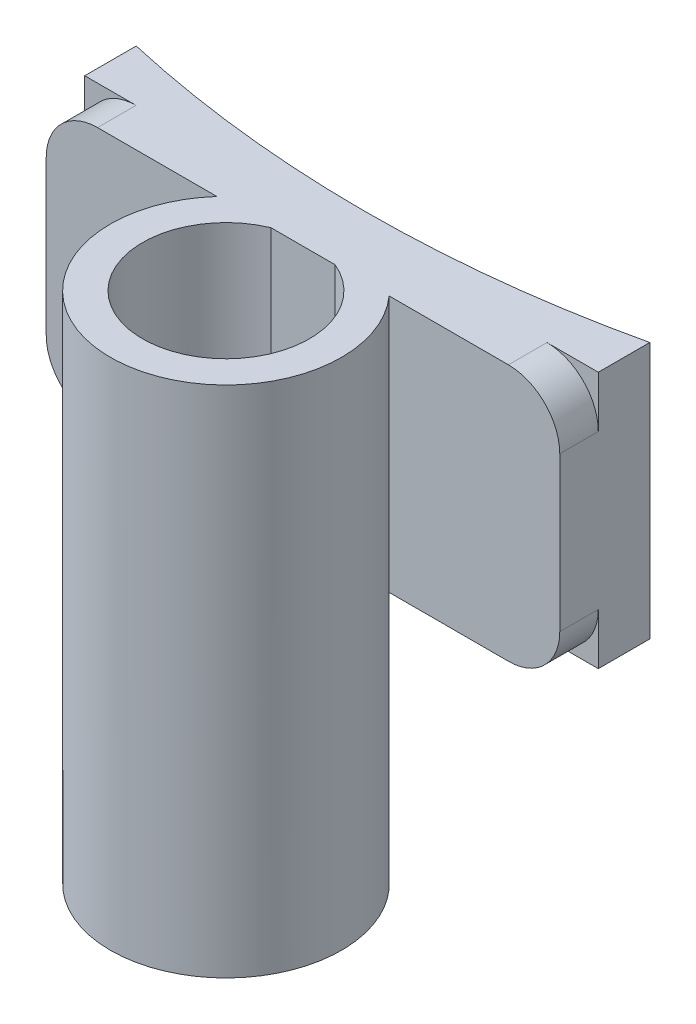
ISO-10303-21;
HEADER;
FILE_DESCRIPTION(('STEP AP214'),'2;1');
FILE_NAME('part.step','',(''),(''),'','','');
FILE_SCHEMA(('AUTOMOTIVE_DESIGN { 1 0 10303 214 1 1 1 1 }'));
ENDSEC;
DATA;
#1=APPLICATION_CONTEXT('core data for automotive mechanical design processes');
#2=APPLICATION_PROTOCOL_DEFINITION('international standard','automotive_design',2000,#1);
#3=PRODUCT_CONTEXT('',#1,'mechanical');
#4=PRODUCT('Part','Part','',(#3));
#5=PRODUCT_RELATED_PRODUCT_CATEGORY('part','',(#4));
#6=PRODUCT_DEFINITION_FORMATION('','',#4);
#7=PRODUCT_DEFINITION_CONTEXT('part definition',#1,'design');
#8=PRODUCT_DEFINITION('design','',#6,#7);
#9=PRODUCT_DEFINITION_SHAPE('','',#8);
#10=(LENGTH_UNIT() NAMED_UNIT(*) SI_UNIT(.MILLI.,.METRE.));
#11=(NAMED_UNIT(*) PLANE_ANGLE_UNIT() SI_UNIT($,.RADIAN.));
#12=(NAMED_UNIT(*) SI_UNIT($,.STERADIAN.) SOLID_ANGLE_UNIT());
#13=UNCERTAINTY_MEASURE_WITH_UNIT(LENGTH_MEASURE(1.E-05),#10,'distance_accuracy_value','');
#14=(GEOMETRIC_REPRESENTATION_CONTEXT(3) GLOBAL_UNCERTAINTY_ASSIGNED_CONTEXT((#13)) GLOBAL_UNIT_ASSIGNED_CONTEXT((#10,
#11,#12)) REPRESENTATION_CONTEXT('',''));
#15=CARTESIAN_POINT('',(0.,0.,0.));
#16=DIRECTION('',(0.,0.,1.));
#17=DIRECTION('',(1.,0.,0.));
#18=AXIS2_PLACEMENT_3D('',#15,#16,#17);
#19=CARTESIAN_POINT('',(0.,20.,0.));
#20=DIRECTION('',(0.,-1.,0.));
#21=DIRECTION('',(0.,0.,-1.));
#22=AXIS2_PLACEMENT_3D('',#19,#20,#21);
#23=CYLINDRICAL_SURFACE('',#22,4.5);
#24=CARTESIAN_POINT('',(0.,0.,0.));
#25=DIRECTION('',(0.,1.,0.));
#26=DIRECTION('',(0.,0.,1.));
#27=AXIS2_PLACEMENT_3D('',#24,#25,#26);
#28=CIRCLE('',#27,4.5);
#29=CARTESIAN_POINT('',(0.,0.,4.5));
#30=VERTEX_POINT('',#29);
#31=EDGE_CURVE('E252',#30,#30,#28,.T.);
#32=ORIENTED_EDGE('',*,*,#31,.T.);
#33=EDGE_LOOP('',(#32));
#34=FACE_BOUND('',#33,.T.);
#35=DIRECTION('',(0.,-1.,0.));
#36=VECTOR('',#35,1.);
#37=CARTESIAN_POINT('',(3.35410196624968,20.,-3.));
#38=LINE('',#37,#36);
#39=CARTESIAN_POINT('',(3.35410196624968,20.,-3.));
#40=VERTEX_POINT('',#39);
#41=CARTESIAN_POINT('',(3.35410196624968,10.,-3.));
#42=VERTEX_POINT('',#41);
#43=EDGE_CURVE('E240',#40,#42,#38,.T.);
#44=ORIENTED_EDGE('',*,*,#43,.F.);
#45=CARTESIAN_POINT('',(0.,20.,0.));
#46=DIRECTION('',(0.,1.,0.));
#47=DIRECTION('',(0.,0.,1.));
#48=AXIS2_PLACEMENT_3D('',#45,#46,#47);
#49=CIRCLE('',#48,4.5);
#50=CARTESIAN_POINT('',(-3.35410196624968,20.,-3.));
#51=VERTEX_POINT('',#50);
#52=EDGE_CURVE('E256',#51,#40,#49,.T.);
#53=ORIENTED_EDGE('',*,*,#52,.F.);
#54=DIRECTION('',(0.,-1.,0.));
#55=VECTOR('',#54,1.);
#56=CARTESIAN_POINT('',(-3.35410196624968,20.,-3.));
#57=LINE('',#56,#55);
#58=CARTESIAN_POINT('',(-3.35410196624968,10.,-3.));
#59=VERTEX_POINT('',#58);
#60=EDGE_CURVE('E236',#59,#51,#57,.F.);
#61=ORIENTED_EDGE('',*,*,#60,.F.);
#62=CARTESIAN_POINT('',(0.,10.,0.));
#63=DIRECTION('',(0.,1.,0.));
#64=DIRECTION('',(0.,0.,1.));
#65=AXIS2_PLACEMENT_3D('',#62,#63,#64);
#66=CIRCLE('',#65,4.5);
#67=EDGE_CURVE('E244',#42,#59,#66,.T.);
#68=ORIENTED_EDGE('',*,*,#67,.F.);
#69=EDGE_LOOP('',(#44,#53,#61,#68));
#70=FACE_BOUND('',#69,.T.);
#71=ADVANCED_FACE('F39',(#34,#70),#23,.T.);
#72=CARTESIAN_POINT('',(0.,20.,0.));
#73=DIRECTION('',(0.,-1.,0.));
#74=DIRECTION('',(0.,0.,-1.));
#75=AXIS2_PLACEMENT_3D('',#72,#73,#74);
#76=CYLINDRICAL_SURFACE('',#75,3.25);
#77=CARTESIAN_POINT('',(0.,0.,0.));
#78=DIRECTION('',(0.,1.,0.));
#79=DIRECTION('',(0.,0.,1.));
#80=AXIS2_PLACEMENT_3D('',#77,#78,#79);
#81=CIRCLE('',#80,3.25);
#82=CARTESIAN_POINT('',(0.,0.,3.25));
#83=VERTEX_POINT('',#82);
#84=EDGE_CURVE('E247',#83,#83,#81,.T.);
#85=ORIENTED_EDGE('',*,*,#84,.F.);
#86=EDGE_LOOP('',(#85));
#87=FACE_BOUND('',#86,.T.);
#88=CARTESIAN_POINT('',(0.,20.,0.));
#89=DIRECTION('',(0.,1.,0.));
#90=DIRECTION('',(0.,0.,1.));
#91=AXIS2_PLACEMENT_3D('',#88,#89,#90);
#92=CIRCLE('',#91,3.25);
#93=CARTESIAN_POINT('',(-1.25,20.,-3.));
#94=VERTEX_POINT('',#93);
#95=CARTESIAN_POINT('',(1.25,20.,-3.));
#96=VERTEX_POINT('',#95);
#97=EDGE_CURVE('E248',#94,#96,#92,.T.);
#98=ORIENTED_EDGE('',*,*,#97,.T.);
#99=DIRECTION('',(0.,-1.,0.));
#100=VECTOR('',#99,1.);
#101=CARTESIAN_POINT('',(1.25,20.,-3.));
#102=LINE('',#101,#100);
#103=CARTESIAN_POINT('',(1.25,10.,-3.));
#104=VERTEX_POINT('',#103);
#105=EDGE_CURVE('E271',#96,#104,#102,.T.);
#106=ORIENTED_EDGE('',*,*,#105,.T.);
#107=CARTESIAN_POINT('',(0.,10.,0.));
#108=DIRECTION('',(0.,1.,0.));
#109=DIRECTION('',(0.,0.,1.));
#110=AXIS2_PLACEMENT_3D('',#107,#108,#109);
#111=CIRCLE('',#110,3.25);
#112=CARTESIAN_POINT('',(-1.25,10.,-3.));
#113=VERTEX_POINT('',#112);
#114=EDGE_CURVE('E267',#104,#113,#111,.T.);
#115=ORIENTED_EDGE('',*,*,#114,.T.);
#116=DIRECTION('',(0.,-1.,0.));
#117=VECTOR('',#116,1.);
#118=CARTESIAN_POINT('',(-1.25,20.,-3.));
#119=LINE('',#118,#117);
#120=EDGE_CURVE('E260',#113,#94,#119,.F.);
#121=ORIENTED_EDGE('',*,*,#120,.T.);
#122=EDGE_LOOP('',(#98,#106,#115,#121));
#123=FACE_BOUND('',#122,.T.);
#124=ADVANCED_FACE('F338',(#87,#123),#76,.F.);
#125=CARTESIAN_POINT('',(0.,20.,0.));
#126=DIRECTION('',(0.,1.,0.));
#127=DIRECTION('',(0.,0.,1.));
#128=AXIS2_PLACEMENT_3D('',#125,#126,#127);
#129=PLANE('',#128);
#130=CARTESIAN_POINT('',(0.,20.,-50.3797485902261));
#131=DIRECTION('',(0.,1.,0.));
#132=DIRECTION('',(0.,0.,1.));
#133=AXIS2_PLACEMENT_3D('',#130,#131,#132);
#134=CIRCLE('',#133,45.);
#135=CARTESIAN_POINT('',(-10.,20.,-6.50492665326547));
#136=VERTEX_POINT('',#135);
#137=CARTESIAN_POINT('',(10.,20.,-6.50492665326547));
#138=VERTEX_POINT('',#137);
#139=EDGE_CURVE('E166',#136,#138,#134,.T.);
#140=ORIENTED_EDGE('',*,*,#139,.F.);
#141=DIRECTION('',(0.,0.,1.));
#142=VECTOR('',#141,1.);
#143=CARTESIAN_POINT('',(-10.,20.,-7.5));
#144=LINE('',#143,#142);
#145=CARTESIAN_POINT('',(-10.,20.,-4.5));
#146=VERTEX_POINT('',#145);
#147=EDGE_CURVE('E198',#136,#146,#144,.T.);
#148=ORIENTED_EDGE('',*,*,#147,.T.);
#149=DIRECTION('',(-1.,0.,0.));
#150=VECTOR('',#149,1.);
#151=CARTESIAN_POINT('',(-10.,20.,-4.5));
#152=LINE('',#151,#150);
#153=CARTESIAN_POINT('',(-8.,20.,-4.5));
#154=VERTEX_POINT('',#153);
#155=EDGE_CURVE('E362',#154,#146,#152,.T.);
#156=ORIENTED_EDGE('',*,*,#155,.F.);
#157=DIRECTION('',(0.,0.,-1.));
#158=VECTOR('',#157,1.);
#159=CARTESIAN_POINT('',(-8.,20.,-3.));
#160=LINE('',#159,#158);
#161=CARTESIAN_POINT('',(-8.,20.,-3.));
#162=VERTEX_POINT('',#161);
#163=EDGE_CURVE('E299',#154,#162,#160,.F.);
#164=ORIENTED_EDGE('',*,*,#163,.T.);
#165=DIRECTION('',(1.,0.,0.));
#166=VECTOR('',#165,1.);
#167=CARTESIAN_POINT('',(-10.,20.,-3.));
#168=LINE('',#167,#166);
#169=EDGE_CURVE('E228',#162,#51,#168,.T.);
#170=ORIENTED_EDGE('',*,*,#169,.T.);
#171=ORIENTED_EDGE('',*,*,#52,.T.);
#172=CARTESIAN_POINT('',(8.,20.,-3.));
#173=VERTEX_POINT('',#172);
#174=EDGE_CURVE('E227',#40,#173,#168,.T.);
#175=ORIENTED_EDGE('',*,*,#174,.T.);
#176=DIRECTION('',(0.,0.,-1.));
#177=VECTOR('',#176,1.);
#178=CARTESIAN_POINT('',(8.,20.,0.));
#179=LINE('',#178,#177);
#180=CARTESIAN_POINT('',(8.,20.,-4.5));
#181=VERTEX_POINT('',#180);
#182=EDGE_CURVE('E295',#173,#181,#179,.T.);
#183=ORIENTED_EDGE('',*,*,#182,.T.);
#184=CARTESIAN_POINT('',(10.,20.,-4.5));
#185=VERTEX_POINT('',#184);
#186=EDGE_CURVE('E357',#185,#181,#152,.T.);
#187=ORIENTED_EDGE('',*,*,#186,.F.);
#188=DIRECTION('',(0.,0.,1.));
#189=VECTOR('',#188,1.);
#190=CARTESIAN_POINT('',(10.,20.,-7.5));
#191=LINE('',#190,#189);
#192=EDGE_CURVE('E206',#138,#185,#191,.T.);
#193=ORIENTED_EDGE('',*,*,#192,.F.);
#194=EDGE_LOOP('',(#140,#148,#156,#164,#170,#171,#175,#183,#187,#193));
#195=FACE_BOUND('',#194,.T.);
#196=EDGE_CURVE('E232',#94,#96,#168,.T.);
#197=ORIENTED_EDGE('',*,*,#196,.T.);
#198=ORIENTED_EDGE('',*,*,#97,.F.);
#199=EDGE_LOOP('',(#197,#198));
#200=FACE_BOUND('',#199,.T.);
#201=ADVANCED_FACE('F341',(#195,#200),#129,.T.);
#202=CARTESIAN_POINT('',(0.,0.,0.));
#203=DIRECTION('',(0.,1.,0.));
#204=DIRECTION('',(0.,0.,1.));
#205=AXIS2_PLACEMENT_3D('',#202,#203,#204);
#206=PLANE('',#205);
#207=ORIENTED_EDGE('',*,*,#31,.F.);
#208=EDGE_LOOP('',(#207));
#209=FACE_BOUND('',#208,.T.);
#210=ORIENTED_EDGE('',*,*,#84,.T.);
#211=EDGE_LOOP('',(#210));
#212=FACE_BOUND('',#211,.T.);
#213=ADVANCED_FACE('F422',(#209,#212),#206,.F.);
#214=CARTESIAN_POINT('',(0.,0.,-3.));
#215=DIRECTION('',(0.,0.,-1.));
#216=DIRECTION('',(-1.,0.,0.));
#217=AXIS2_PLACEMENT_3D('',#214,#215,#216);
#218=PLANE('',#217);
#219=ORIENTED_EDGE('',*,*,#105,.F.);
#220=ORIENTED_EDGE('',*,*,#196,.F.);
#221=ORIENTED_EDGE('',*,*,#120,.F.);
#222=DIRECTION('',(1.,0.,0.));
#223=VECTOR('',#222,1.);
#224=CARTESIAN_POINT('',(-10.,10.,-3.));
#225=LINE('',#224,#223);
#226=EDGE_CURVE('E222',#113,#104,#225,.T.);
#227=ORIENTED_EDGE('',*,*,#226,.T.);
#228=EDGE_LOOP('',(#219,#220,#221,#227));
#229=FACE_BOUND('',#228,.T.);
#230=ADVANCED_FACE('F334',(#229),#218,.F.);
#231=CARTESIAN_POINT('',(-10.,10.,-3.));
#232=DIRECTION('',(0.,1.,0.));
#233=DIRECTION('',(0.,0.,1.));
#234=AXIS2_PLACEMENT_3D('',#231,#232,#233);
#235=PLANE('',#234);
#236=ORIENTED_EDGE('',*,*,#114,.F.);
#237=ORIENTED_EDGE('',*,*,#226,.F.);
#238=EDGE_LOOP('',(#236,#237));
#239=FACE_BOUND('',#238,.T.);
#240=ADVANCED_FACE('F437',(#239),#235,.F.);
#241=CARTESIAN_POINT('',(8.,10.,-3.));
#242=VERTEX_POINT('',#241);
#243=EDGE_CURVE('E223',#42,#242,#225,.T.);
#244=ORIENTED_EDGE('',*,*,#243,.T.);
#245=CARTESIAN_POINT('',(8.,12.,-3.));
#246=DIRECTION('',(0.,0.,-1.));
#247=DIRECTION('',(-1.,0.,0.));
#248=AXIS2_PLACEMENT_3D('',#245,#246,#247);
#249=CIRCLE('',#248,2.);
#250=CARTESIAN_POINT('',(10.,12.,-3.));
#251=VERTEX_POINT('',#250);
#252=EDGE_CURVE('E311',#242,#251,#249,.F.);
#253=ORIENTED_EDGE('',*,*,#252,.T.);
#254=DIRECTION('',(0.,-1.,0.));
#255=VECTOR('',#254,1.);
#256=CARTESIAN_POINT('',(10.,20.,-3.));
#257=LINE('',#256,#255);
#258=CARTESIAN_POINT('',(10.,18.,-3.));
#259=VERTEX_POINT('',#258);
#260=EDGE_CURVE('E221',#259,#251,#257,.T.);
#261=ORIENTED_EDGE('',*,*,#260,.F.);
#262=CARTESIAN_POINT('',(8.,18.,-3.));
#263=DIRECTION('',(0.,0.,-1.));
#264=DIRECTION('',(-1.,0.,0.));
#265=AXIS2_PLACEMENT_3D('',#262,#263,#264);
#266=CIRCLE('',#265,2.);
#267=EDGE_CURVE('E308',#259,#173,#266,.F.);
#268=ORIENTED_EDGE('',*,*,#267,.T.);
#269=ORIENTED_EDGE('',*,*,#174,.F.);
#270=ORIENTED_EDGE('',*,*,#43,.T.);
#271=EDGE_LOOP('',(#244,#253,#261,#268,#269,#270));
#272=FACE_BOUND('',#271,.T.);
#273=ADVANCED_FACE('F435',(#272),#218,.F.);
#274=DIRECTION('',(0.,-1.,0.));
#275=VECTOR('',#274,1.);
#276=CARTESIAN_POINT('',(-10.,20.,-3.));
#277=LINE('',#276,#275);
#278=CARTESIAN_POINT('',(-10.,18.,-3.));
#279=VERTEX_POINT('',#278);
#280=CARTESIAN_POINT('',(-10.,12.,-3.));
#281=VERTEX_POINT('',#280);
#282=EDGE_CURVE('E231',#279,#281,#277,.T.);
#283=ORIENTED_EDGE('',*,*,#282,.T.);
#284=CARTESIAN_POINT('',(-8.,12.,-3.));
#285=DIRECTION('',(0.,0.,-1.));
#286=DIRECTION('',(-1.,0.,0.));
#287=AXIS2_PLACEMENT_3D('',#284,#285,#286);
#288=CIRCLE('',#287,2.);
#289=CARTESIAN_POINT('',(-8.,10.,-3.));
#290=VERTEX_POINT('',#289);
#291=EDGE_CURVE('E292',#281,#290,#288,.F.);
#292=ORIENTED_EDGE('',*,*,#291,.T.);
#293=EDGE_CURVE('E217',#290,#59,#225,.T.);
#294=ORIENTED_EDGE('',*,*,#293,.T.);
#295=ORIENTED_EDGE('',*,*,#60,.T.);
#296=ORIENTED_EDGE('',*,*,#169,.F.);
#297=CARTESIAN_POINT('',(-8.,18.,-3.));
#298=DIRECTION('',(0.,0.,-1.));
#299=DIRECTION('',(-1.,0.,0.));
#300=AXIS2_PLACEMENT_3D('',#297,#298,#299);
#301=CIRCLE('',#300,2.);
#302=EDGE_CURVE('E289',#162,#279,#301,.F.);
#303=ORIENTED_EDGE('',*,*,#302,.T.);
#304=EDGE_LOOP('',(#283,#292,#294,#295,#296,#303));
#305=FACE_BOUND('',#304,.T.);
#306=ADVANCED_FACE('F393',(#305),#218,.F.);
#307=DIRECTION('',(0.,0.,1.));
#308=VECTOR('',#307,1.);
#309=CARTESIAN_POINT('',(-10.,10.,-7.5));
#310=LINE('',#309,#308);
#311=CARTESIAN_POINT('',(-10.,10.,-6.50492665326547));
#312=VERTEX_POINT('',#311);
#313=CARTESIAN_POINT('',(-10.,10.,-4.5));
#314=VERTEX_POINT('',#313);
#315=EDGE_CURVE('E181',#312,#314,#310,.T.);
#316=ORIENTED_EDGE('',*,*,#315,.F.);
#317=CARTESIAN_POINT('',(0.,10.,-50.3797485902261));
#318=DIRECTION('',(0.,1.,0.));
#319=DIRECTION('',(0.,0.,1.));
#320=AXIS2_PLACEMENT_3D('',#317,#318,#319);
#321=CIRCLE('',#320,45.);
#322=CARTESIAN_POINT('',(10.,10.,-6.50492665326547));
#323=VERTEX_POINT('',#322);
#324=EDGE_CURVE('E55',#312,#323,#321,.T.);
#325=ORIENTED_EDGE('',*,*,#324,.T.);
#326=DIRECTION('',(0.,0.,1.));
#327=VECTOR('',#326,1.);
#328=CARTESIAN_POINT('',(10.,10.,-7.5));
#329=LINE('',#328,#327);
#330=CARTESIAN_POINT('',(10.,10.,-4.5));
#331=VERTEX_POINT('',#330);
#332=EDGE_CURVE('E178',#323,#331,#329,.T.);
#333=ORIENTED_EDGE('',*,*,#332,.T.);
#334=DIRECTION('',(1.,0.,0.));
#335=VECTOR('',#334,1.);
#336=CARTESIAN_POINT('',(-10.,10.,-4.5));
#337=LINE('',#336,#335);
#338=CARTESIAN_POINT('',(8.,10.,-4.5));
#339=VERTEX_POINT('',#338);
#340=EDGE_CURVE('E370',#339,#331,#337,.T.);
#341=ORIENTED_EDGE('',*,*,#340,.F.);
#342=DIRECTION('',(0.,0.,-1.));
#343=VECTOR('',#342,1.);
#344=CARTESIAN_POINT('',(8.,10.,-3.));
#345=LINE('',#344,#343);
#346=EDGE_CURVE('E275',#339,#242,#345,.F.);
#347=ORIENTED_EDGE('',*,*,#346,.T.);
#348=ORIENTED_EDGE('',*,*,#243,.F.);
#349=ORIENTED_EDGE('',*,*,#67,.T.);
#350=ORIENTED_EDGE('',*,*,#293,.F.);
#351=DIRECTION('',(0.,0.,-1.));
#352=VECTOR('',#351,1.);
#353=CARTESIAN_POINT('',(-8.,10.,-3.));
#354=LINE('',#353,#352);
#355=CARTESIAN_POINT('',(-8.,10.,-4.5));
#356=VERTEX_POINT('',#355);
#357=EDGE_CURVE('E278',#290,#356,#354,.T.);
#358=ORIENTED_EDGE('',*,*,#357,.T.);
#359=EDGE_CURVE('E201',#314,#356,#337,.T.);
#360=ORIENTED_EDGE('',*,*,#359,.F.);
#361=EDGE_LOOP('',(#316,#325,#333,#341,#347,#348,#349,#350,#358,#360));
#362=FACE_BOUND('',#361,.T.);
#363=ADVANCED_FACE('F176',(#362),#235,.F.);
#364=CARTESIAN_POINT('',(10.,20.,-3.));
#365=DIRECTION('',(1.,0.,0.));
#366=DIRECTION('',(0.,0.,-1.));
#367=AXIS2_PLACEMENT_3D('',#364,#365,#366);
#368=PLANE('',#367);
#369=DIRECTION('',(0.,1.,0.));
#370=VECTOR('',#369,1.);
#371=CARTESIAN_POINT('',(10.,10.,-6.50492665326547));
#372=LINE('',#371,#370);
#373=EDGE_CURVE('E162',#138,#323,#372,.F.);
#374=ORIENTED_EDGE('',*,*,#373,.F.);
#375=ORIENTED_EDGE('',*,*,#192,.T.);
#376=DIRECTION('',(0.,1.,0.));
#377=VECTOR('',#376,1.);
#378=CARTESIAN_POINT('',(10.,20.,-4.5));
#379=LINE('',#378,#377);
#380=CARTESIAN_POINT('',(10.,18.,-4.5));
#381=VERTEX_POINT('',#380);
#382=EDGE_CURVE('E171',#381,#185,#379,.T.);
#383=ORIENTED_EDGE('',*,*,#382,.F.);
#384=DIRECTION('',(0.,0.,-1.));
#385=VECTOR('',#384,1.);
#386=CARTESIAN_POINT('',(10.,18.,-3.));
#387=LINE('',#386,#385);
#388=EDGE_CURVE('E302',#381,#259,#387,.F.);
#389=ORIENTED_EDGE('',*,*,#388,.T.);
#390=ORIENTED_EDGE('',*,*,#260,.T.);
#391=DIRECTION('',(0.,0.,-1.));
#392=VECTOR('',#391,1.);
#393=CARTESIAN_POINT('',(10.,12.,-6.));
#394=LINE('',#393,#392);
#395=CARTESIAN_POINT('',(10.,12.,-4.5));
#396=VERTEX_POINT('',#395);
#397=EDGE_CURVE('E305',#251,#396,#394,.T.);
#398=ORIENTED_EDGE('',*,*,#397,.T.);
#399=EDGE_CURVE('E189',#331,#396,#379,.T.);
#400=ORIENTED_EDGE('',*,*,#399,.F.);
#401=ORIENTED_EDGE('',*,*,#332,.F.);
#402=EDGE_LOOP('',(#374,#375,#383,#389,#390,#398,#400,#401));
#403=FACE_BOUND('',#402,.T.);
#404=ADVANCED_FACE('F186',(#403),#368,.T.);
#405=CARTESIAN_POINT('',(-10.,20.,-3.));
#406=DIRECTION('',(1.,0.,0.));
#407=DIRECTION('',(0.,0.,-1.));
#408=AXIS2_PLACEMENT_3D('',#405,#406,#407);
#409=PLANE('',#408);
#410=ORIENTED_EDGE('',*,*,#147,.F.);
#411=DIRECTION('',(0.,1.,0.));
#412=VECTOR('',#411,1.);
#413=CARTESIAN_POINT('',(-10.,10.,-6.50492665326547));
#414=LINE('',#413,#412);
#415=EDGE_CURVE('E172',#136,#312,#414,.F.);
#416=ORIENTED_EDGE('',*,*,#415,.T.);
#417=ORIENTED_EDGE('',*,*,#315,.T.);
#418=DIRECTION('',(0.,-1.,0.));
#419=VECTOR('',#418,1.);
#420=CARTESIAN_POINT('',(-10.,20.,-4.5));
#421=LINE('',#420,#419);
#422=CARTESIAN_POINT('',(-10.,12.,-4.5));
#423=VERTEX_POINT('',#422);
#424=EDGE_CURVE('E366',#423,#314,#421,.T.);
#425=ORIENTED_EDGE('',*,*,#424,.F.);
#426=DIRECTION('',(0.,0.,-1.));
#427=VECTOR('',#426,1.);
#428=CARTESIAN_POINT('',(-10.,12.,-3.));
#429=LINE('',#428,#427);
#430=EDGE_CURVE('E286',#423,#281,#429,.F.);
#431=ORIENTED_EDGE('',*,*,#430,.T.);
#432=ORIENTED_EDGE('',*,*,#282,.F.);
#433=DIRECTION('',(0.,0.,-1.));
#434=VECTOR('',#433,1.);
#435=CARTESIAN_POINT('',(-10.,18.,-6.));
#436=LINE('',#435,#434);
#437=CARTESIAN_POINT('',(-10.,18.,-4.5));
#438=VERTEX_POINT('',#437);
#439=EDGE_CURVE('E282',#279,#438,#436,.T.);
#440=ORIENTED_EDGE('',*,*,#439,.T.);
#441=EDGE_CURVE('E367',#146,#438,#421,.T.);
#442=ORIENTED_EDGE('',*,*,#441,.F.);
#443=EDGE_LOOP('',(#410,#416,#417,#425,#431,#432,#440,#442));
#444=FACE_BOUND('',#443,.T.);
#445=ADVANCED_FACE('F390',(#444),#409,.F.);
#446=CARTESIAN_POINT('',(-8.,12.,-3.));
#447=DIRECTION('',(0.,0.,-1.));
#448=DIRECTION('',(-1.,0.,0.));
#449=AXIS2_PLACEMENT_3D('',#446,#447,#448);
#450=CYLINDRICAL_SURFACE('',#449,2.);
#451=CARTESIAN_POINT('',(-8.,12.,-4.5));
#452=DIRECTION('',(0.,0.,1.));
#453=DIRECTION('',(1.,0.,0.));
#454=AXIS2_PLACEMENT_3D('',#451,#452,#453);
#455=CIRCLE('',#454,2.);
#456=EDGE_CURVE('E212',#356,#423,#455,.F.);
#457=ORIENTED_EDGE('',*,*,#456,.F.);
#458=ORIENTED_EDGE('',*,*,#357,.F.);
#459=ORIENTED_EDGE('',*,*,#291,.F.);
#460=ORIENTED_EDGE('',*,*,#430,.F.);
#461=EDGE_LOOP('',(#457,#458,#459,#460));
#462=FACE_BOUND('',#461,.T.);
#463=ADVANCED_FACE('F387',(#462),#450,.T.);
#464=CARTESIAN_POINT('',(-8.,18.,-3.));
#465=DIRECTION('',(0.,0.,1.));
#466=DIRECTION('',(1.,0.,0.));
#467=AXIS2_PLACEMENT_3D('',#464,#465,#466);
#468=CYLINDRICAL_SURFACE('',#467,2.);
#469=CARTESIAN_POINT('',(-8.,18.,-4.5));
#470=DIRECTION('',(0.,0.,1.));
#471=DIRECTION('',(1.,0.,0.));
#472=AXIS2_PLACEMENT_3D('',#469,#470,#471);
#473=CIRCLE('',#472,2.);
#474=EDGE_CURVE('E196',#438,#154,#473,.F.);
#475=ORIENTED_EDGE('',*,*,#474,.F.);
#476=ORIENTED_EDGE('',*,*,#439,.F.);
#477=ORIENTED_EDGE('',*,*,#302,.F.);
#478=ORIENTED_EDGE('',*,*,#163,.F.);
#479=EDGE_LOOP('',(#475,#476,#477,#478));
#480=FACE_BOUND('',#479,.T.);
#481=ADVANCED_FACE('F397',(#480),#468,.T.);
#482=CARTESIAN_POINT('',(8.,12.,-3.));
#483=DIRECTION('',(0.,0.,1.));
#484=DIRECTION('',(1.,0.,0.));
#485=AXIS2_PLACEMENT_3D('',#482,#483,#484);
#486=CYLINDRICAL_SURFACE('',#485,2.);
#487=CARTESIAN_POINT('',(8.,12.,-4.5));
#488=DIRECTION('',(0.,0.,1.));
#489=DIRECTION('',(1.,0.,0.));
#490=AXIS2_PLACEMENT_3D('',#487,#488,#489);
#491=CIRCLE('',#490,2.);
#492=EDGE_CURVE('E191',#396,#339,#491,.F.);
#493=ORIENTED_EDGE('',*,*,#492,.F.);
#494=ORIENTED_EDGE('',*,*,#397,.F.);
#495=ORIENTED_EDGE('',*,*,#252,.F.);
#496=ORIENTED_EDGE('',*,*,#346,.F.);
#497=EDGE_LOOP('',(#493,#494,#495,#496));
#498=FACE_BOUND('',#497,.T.);
#499=ADVANCED_FACE('F427',(#498),#486,.T.);
#500=CARTESIAN_POINT('',(8.,18.,0.));
#501=DIRECTION('',(0.,0.,-1.));
#502=DIRECTION('',(-1.,0.,0.));
#503=AXIS2_PLACEMENT_3D('',#500,#501,#502);
#504=CYLINDRICAL_SURFACE('',#503,2.);
#505=CARTESIAN_POINT('',(8.,18.,-4.5));
#506=DIRECTION('',(0.,0.,1.));
#507=DIRECTION('',(1.,0.,0.));
#508=AXIS2_PLACEMENT_3D('',#505,#506,#507);
#509=CIRCLE('',#508,2.);
#510=EDGE_CURVE('E48',#181,#381,#509,.F.);
#511=ORIENTED_EDGE('',*,*,#510,.F.);
#512=ORIENTED_EDGE('',*,*,#182,.F.);
#513=ORIENTED_EDGE('',*,*,#267,.F.);
#514=ORIENTED_EDGE('',*,*,#388,.F.);
#515=EDGE_LOOP('',(#511,#512,#513,#514));
#516=FACE_BOUND('',#515,.T.);
#517=ADVANCED_FACE('F41',(#516),#504,.T.);
#518=CARTESIAN_POINT('',(0.,0.,-4.5));
#519=DIRECTION('',(0.,0.,1.));
#520=DIRECTION('',(1.,0.,0.));
#521=AXIS2_PLACEMENT_3D('',#518,#519,#520);
#522=PLANE('',#521);
#523=ORIENTED_EDGE('',*,*,#359,.T.);
#524=ORIENTED_EDGE('',*,*,#456,.T.);
#525=ORIENTED_EDGE('',*,*,#424,.T.);
#526=EDGE_LOOP('',(#523,#524,#525));
#527=FACE_BOUND('',#526,.T.);
#528=ADVANCED_FACE('F380',(#527),#522,.T.);
#529=ORIENTED_EDGE('',*,*,#441,.T.);
#530=ORIENTED_EDGE('',*,*,#474,.T.);
#531=ORIENTED_EDGE('',*,*,#155,.T.);
#532=EDGE_LOOP('',(#529,#530,#531));
#533=FACE_BOUND('',#532,.T.);
#534=ADVANCED_FACE('F399',(#533),#522,.T.);
#535=ORIENTED_EDGE('',*,*,#399,.T.);
#536=ORIENTED_EDGE('',*,*,#492,.T.);
#537=ORIENTED_EDGE('',*,*,#340,.T.);
#538=EDGE_LOOP('',(#535,#536,#537));
#539=FACE_BOUND('',#538,.T.);
#540=ADVANCED_FACE('F402',(#539),#522,.T.);
#541=ORIENTED_EDGE('',*,*,#186,.T.);
#542=ORIENTED_EDGE('',*,*,#510,.T.);
#543=ORIENTED_EDGE('',*,*,#382,.T.);
#544=EDGE_LOOP('',(#541,#542,#543));
#545=FACE_BOUND('',#544,.T.);
#546=ADVANCED_FACE('F356',(#545),#522,.T.);
#547=CARTESIAN_POINT('',(0.,10.,-50.3797485902261));
#548=DIRECTION('',(0.,1.,0.));
#549=DIRECTION('',(0.,0.,1.));
#550=AXIS2_PLACEMENT_3D('',#547,#548,#549);
#551=CYLINDRICAL_SURFACE('',#550,45.);
#552=ORIENTED_EDGE('',*,*,#373,.T.);
#553=ORIENTED_EDGE('',*,*,#324,.F.);
#554=ORIENTED_EDGE('',*,*,#415,.F.);
#555=ORIENTED_EDGE('',*,*,#139,.T.);
#556=EDGE_LOOP('',(#552,#553,#554,#555));
#557=FACE_BOUND('',#556,.T.);
#558=DIRECTION('',(0.,1.,0.));
#559=VECTOR('',#558,1.);
#560=CARTESIAN_POINT('',(-7.4456641791264,10.,-6.));
#561=LINE('',#560,#559);
#562=CARTESIAN_POINT('',(-7.4456641791264,13.0095941295789,-6.));
#563=VERTEX_POINT('',#562);
#564=CARTESIAN_POINT('',(-7.4456641791264,16.9904058704211,-6.));
#565=VERTEX_POINT('',#564);
#566=EDGE_CURVE('E11',#563,#565,#561,.T.);
#567=ORIENTED_EDGE('',*,*,#566,.T.);
#568=CARTESIAN_POINT('',(-7.4456641791264,13.0095941295789,-6.));
#569=CARTESIAN_POINT('',(-7.50236757756673,13.0151691276723,-6.00951261142827));
#570=CARTESIAN_POINT('',(-7.55879354227858,13.0231631121346,-6.01909176644046));
#571=CARTESIAN_POINT('',(-7.67074623099448,13.0439280764467,-6.03831345280099));
#572=CARTESIAN_POINT('',(-7.72627298939188,13.056698873138,-6.04795598170545));
#573=CARTESIAN_POINT('',(-7.8908616917195,13.1020493670212,-6.07685187014762));
#574=CARTESIAN_POINT('',(-7.99807080397341,13.1416809536709,-6.09609686505013));
#575=CARTESIAN_POINT('',(-8.20429987147587,13.2386596556181,-6.1338392381241));
#576=CARTESIAN_POINT('',(-8.30331560695398,13.2960158283594,-6.15233622858015));
#577=CARTESIAN_POINT('',(-8.49030268617257,13.4268947417882,-6.18785093029005));
#578=CARTESIAN_POINT('',(-8.57827702330231,13.5004130858772,-6.20486904209024));
#579=CARTESIAN_POINT('',(-8.74014644044473,13.6611913229174,-6.23661067464997));
#580=CARTESIAN_POINT('',(-8.81411484776558,13.748375017539,-6.25134606819244));
#581=CARTESIAN_POINT('',(-8.94630454237955,13.9343711336167,-6.27795501652774));
#582=CARTESIAN_POINT('',(-9.00452495656499,14.0331841993981,-6.28982841264038));
#583=CARTESIAN_POINT('',(-9.10247647194099,14.2377858271443,-6.30994724155951));
#584=CARTESIAN_POINT('',(-9.1425129304383,14.3434222946109,-6.31825245414167));
#585=CARTESIAN_POINT('',(-9.20427773539698,14.560128174063,-6.3311132300199));
#586=CARTESIAN_POINT('',(-9.22600927173964,14.6711966358789,-6.33566944662623));
#587=CARTESIAN_POINT('',(-9.25023135831475,14.893470723546,-6.34075028880055));
#588=CARTESIAN_POINT('',(-9.25306151333433,15.0046378252114,-6.34134607133857));
#589=CARTESIAN_POINT('',(-9.24029194751527,15.225857590882,-6.33866497415159));
#590=CARTESIAN_POINT('',(-9.22469303678337,15.335910303659,-6.33538826465398));
#591=CARTESIAN_POINT('',(-9.17572011013794,15.5510946092051,-6.32516002223962));
#592=CARTESIAN_POINT('',(-9.14245475659783,15.6562520567434,-6.31823095608583));
#593=CARTESIAN_POINT('',(-9.05925142406391,15.859456144805,-6.30104900126985));
#594=CARTESIAN_POINT('',(-9.00931247400145,15.9575023707665,-6.29079591901831));
#595=CARTESIAN_POINT('',(-8.89367655817685,16.1447980061868,-6.26732381300292));
#596=CARTESIAN_POINT('',(-8.82782595027015,16.2339488725558,-6.25407595762224));
#597=CARTESIAN_POINT('',(-8.68256009104138,16.3999789705418,-6.22526274606713));
#598=CARTESIAN_POINT('',(-8.60314355026555,16.4768570342732,-6.20969716960935));
#599=CARTESIAN_POINT('',(-8.43134805536927,16.6177118842863,-6.176579530975));
#600=CARTESIAN_POINT('',(-8.3387506363853,16.6814144419909,-6.15899522576697));
#601=CARTESIAN_POINT('',(-8.14436944149982,16.792378119403,-6.12278299365915));
#602=CARTESIAN_POINT('',(-8.04258759193733,16.8396426767622,-6.10415528591162));
#603=CARTESIAN_POINT('',(-7.85839250677212,16.9070890578099,-6.0711473761891));
#604=CARTESIAN_POINT('',(-7.777331672362,16.9310675768715,-6.05684278503004));
#605=CARTESIAN_POINT('',(-7.61292834071982,16.9686038294252,-6.02830694077802));
#606=CARTESIAN_POINT('',(-7.52958877433354,16.9821743515717,-6.01407561909355));
#607=CARTESIAN_POINT('',(-7.4456641791264,16.9904058704211,-6.));
#608=B_SPLINE_CURVE_WITH_KNOTS('',3,(#568,#569,#570,#571,#572,#573,#574,#575,#576,#577,#578,
#579,#580,#581,#582,#583,#584,#585,#586,#587,#588,#589,#590,#591,#592,#593,#594,#595,#596,#597,
#598,#599,#600,#601,#602,#603,#604,#605,#606,#607),.UNSPECIFIED.,.F.,.F.,(4,2,2,2,2,2,2,2,2,2,2,
2,2,2,2,2,2,2,2,4),(0.,0.173189594979404,0.346372549986241,0.69231974441367,1.03844401452498,
1.38447424464184,1.72863947850447,2.07282378982931,2.41099273444816,2.74910273633663,
3.08112111538989,3.41312490008861,3.7431098597087,4.07311404097463,4.40644187842149,
4.7398014166177,5.07952324463388,5.41917398440579,5.67574122328453,5.93199270209313),.UNSPECIFIED.);
#609=EDGE_CURVE('E183',#563,#565,#608,.T.);
#610=ORIENTED_EDGE('',*,*,#609,.F.);
#611=EDGE_LOOP('',(#567,#610));
#612=FACE_BOUND('',#611,.T.);
#613=DIRECTION('',(0.,1.,0.));
#614=VECTOR('',#613,1.);
#615=CARTESIAN_POINT('',(7.4456641791264,10.,-6.));
#616=LINE('',#615,#614);
#617=CARTESIAN_POINT('',(7.4456641791264,16.9904058704211,-6.));
#618=VERTEX_POINT('',#617);
#619=CARTESIAN_POINT('',(7.4456641791264,13.0095941295789,-6.));
#620=VERTEX_POINT('',#619);
#621=EDGE_CURVE('E480',#618,#620,#616,.F.);
#622=ORIENTED_EDGE('',*,*,#621,.T.);
#623=CARTESIAN_POINT('',(7.4456641791264,16.9904058704211,-6.));
#624=CARTESIAN_POINT('',(7.50236757756673,16.9848308723277,-6.00951261142828));
#625=CARTESIAN_POINT('',(7.55879354227858,16.9768368878654,-6.01909176644046));
#626=CARTESIAN_POINT('',(7.67074623099448,16.9560719235532,-6.03831345280099));
#627=CARTESIAN_POINT('',(7.72627298939188,16.943301126862,-6.04795598170545));
#628=CARTESIAN_POINT('',(7.8908616917195,16.8979506329788,-6.07685187014762));
#629=CARTESIAN_POINT('',(7.99807080397341,16.8583190463291,-6.09609686505012));
#630=CARTESIAN_POINT('',(8.20429987147587,16.7613403443819,-6.1338392381241));
#631=CARTESIAN_POINT('',(8.30331560695398,16.7039841716406,-6.15233622858015));
#632=CARTESIAN_POINT('',(8.49030268617257,16.5731052582118,-6.18785093029006));
#633=CARTESIAN_POINT('',(8.57827702330231,16.4995869141228,-6.20486904209024));
#634=CARTESIAN_POINT('',(8.74014644044473,16.3388086770826,-6.23661067464997));
#635=CARTESIAN_POINT('',(8.81411484776558,16.251624982461,-6.25134606819244));
#636=CARTESIAN_POINT('',(8.94630454237955,16.0656288663833,-6.27795501652774));
#637=CARTESIAN_POINT('',(9.00452495656499,15.9668158006019,-6.28982841264038));
#638=CARTESIAN_POINT('',(9.10247647194099,15.7622141728557,-6.30994724155951));
#639=CARTESIAN_POINT('',(9.1425129304383,15.6565777053891,-6.31825245414167));
#640=CARTESIAN_POINT('',(9.20427773539698,15.439871825937,-6.33111323001991));
#641=CARTESIAN_POINT('',(9.22600927173964,15.3288033641211,-6.33566944662624));
#642=CARTESIAN_POINT('',(9.25023135831475,15.106529276454,-6.34075028880056));
#643=CARTESIAN_POINT('',(9.25306151333433,14.9953621747886,-6.34134607133857));
#644=CARTESIAN_POINT('',(9.24029194751527,14.774142409118,-6.33866497415159));
#645=CARTESIAN_POINT('',(9.22469303678337,14.6640896963409,-6.33538826465398));
#646=CARTESIAN_POINT('',(9.17572011013794,14.4489053907949,-6.32516002223963));
#647=CARTESIAN_POINT('',(9.14245475659783,14.3437479432566,-6.31823095608583));
#648=CARTESIAN_POINT('',(9.05925142406391,14.140543855195,-6.30104900126985));
#649=CARTESIAN_POINT('',(9.00931247400145,14.0424976292335,-6.29079591901831));
#650=CARTESIAN_POINT('',(8.89367655817685,13.8552019938132,-6.26732381300292));
#651=CARTESIAN_POINT('',(8.82782595027016,13.7660511274442,-6.25407595762223));
#652=CARTESIAN_POINT('',(8.68256009104138,13.6000210294582,-6.22526274606712));
#653=CARTESIAN_POINT('',(8.60314355026555,13.5231429657268,-6.20969716960935));
#654=CARTESIAN_POINT('',(8.43134805536927,13.3822881157137,-6.176579530975));
#655=CARTESIAN_POINT('',(8.3387506363853,13.3185855580091,-6.15899522576697));
#656=CARTESIAN_POINT('',(8.14436944149982,13.207621880597,-6.12278299365915));
#657=CARTESIAN_POINT('',(8.04258759193734,13.1603573232378,-6.10415528591162));
#658=CARTESIAN_POINT('',(7.85839250677212,13.0929109421901,-6.0711473761891));
#659=CARTESIAN_POINT('',(7.777331672362,13.0689324231285,-6.05684278503004));
#660=CARTESIAN_POINT('',(7.61292834071982,13.0313961705748,-6.02830694077802));
#661=CARTESIAN_POINT('',(7.52958877433354,13.0178256484283,-6.01407561909354));
#662=CARTESIAN_POINT('',(7.4456641791264,13.0095941295789,-5.99999999999999));
#663=B_SPLINE_CURVE_WITH_KNOTS('',3,(#623,#624,#625,#626,#627,#628,#629,#630,#631,#632,#633,
#634,#635,#636,#637,#638,#639,#640,#641,#642,#643,#644,#645,#646,#647,#648,#649,#650,#651,#652,
#653,#654,#655,#656,#657,#658,#659,#660,#661,#662),.UNSPECIFIED.,.F.,.F.,(4,2,2,2,2,2,2,2,2,2,2,
2,2,2,2,2,2,2,2,4),(0.,0.173189594979403,0.346372549986239,0.69231974441367,1.03844401452498,
1.38447424464184,1.72863947850447,2.07282378982931,2.41099273444816,2.74910273633663,
3.08112111538989,3.41312490008861,3.74310985970871,4.07311404097463,4.40644187842149,
4.73980141661771,5.07952324463388,5.41917398440579,5.67574122328453,5.93199270209313),.UNSPECIFIED.);
#664=EDGE_CURVE('E62',#618,#620,#663,.T.);
#665=ORIENTED_EDGE('',*,*,#664,.F.);
#666=EDGE_LOOP('',(#622,#665));
#667=FACE_BOUND('',#666,.T.);
#668=ADVANCED_FACE('F163',(#557,#612,#667),#551,.F.);
#669=CARTESIAN_POINT('',(0.,0.,-6.));
#670=DIRECTION('',(0.,0.,-1.));
#671=DIRECTION('',(-1.,0.,0.));
#672=AXIS2_PLACEMENT_3D('',#669,#670,#671);
#673=PLANE('',#672);
#674=ORIENTED_EDGE('',*,*,#621,.F.);
#675=CARTESIAN_POINT('',(7.25,15.,-6.));
#676=DIRECTION('',(0.,0.,-1.));
#677=DIRECTION('',(-1.,0.,0.));
#678=AXIS2_PLACEMENT_3D('',#675,#676,#677);
#679=CIRCLE('',#678,2.);
#680=EDGE_CURVE('E216',#618,#620,#679,.T.);
#681=ORIENTED_EDGE('',*,*,#680,.T.);
#682=EDGE_LOOP('',(#674,#681));
#683=FACE_BOUND('',#682,.T.);
#684=ADVANCED_FACE('F466',(#683),#673,.T.);
#685=CARTESIAN_POINT('',(7.25,15.,-7.5));
#686=DIRECTION('',(0.,0.,1.));
#687=DIRECTION('',(1.,0.,0.));
#688=AXIS2_PLACEMENT_3D('',#685,#686,#687);
#689=CYLINDRICAL_SURFACE('',#688,2.);
#690=ORIENTED_EDGE('',*,*,#680,.F.);
#691=ORIENTED_EDGE('',*,*,#664,.T.);
#692=EDGE_LOOP('',(#690,#691));
#693=FACE_BOUND('',#692,.T.);
#694=ADVANCED_FACE('F465',(#693),#689,.F.);
#695=ORIENTED_EDGE('',*,*,#566,.F.);
#696=CARTESIAN_POINT('',(-7.25,15.,-6.));
#697=DIRECTION('',(0.,0.,-1.));
#698=DIRECTION('',(-1.,0.,0.));
#699=AXIS2_PLACEMENT_3D('',#696,#697,#698);
#700=CIRCLE('',#699,2.);
#701=EDGE_CURVE('E319',#563,#565,#700,.T.);
#702=ORIENTED_EDGE('',*,*,#701,.T.);
#703=EDGE_LOOP('',(#695,#702));
#704=FACE_BOUND('',#703,.T.);
#705=ADVANCED_FACE('F462',(#704),#673,.T.);
#706=CARTESIAN_POINT('',(-7.25,15.,-7.5));
#707=DIRECTION('',(0.,0.,1.));
#708=DIRECTION('',(1.,0.,0.));
#709=AXIS2_PLACEMENT_3D('',#706,#707,#708);
#710=CYLINDRICAL_SURFACE('',#709,2.);
#711=ORIENTED_EDGE('',*,*,#701,.F.);
#712=ORIENTED_EDGE('',*,*,#609,.T.);
#713=EDGE_LOOP('',(#711,#712));
#714=FACE_BOUND('',#713,.T.);
#715=ADVANCED_FACE('F464',(#714),#710,.F.);
#716=CLOSED_SHELL('',(#71,#124,#201,#213,#230,#240,#273,#306,#363,#404,#445,#463,#481,#499,#517,
#528,#534,#540,#546,#668,#684,#694,#705,#715));
#717=MANIFOLD_SOLID_BREP('B2',#716);
#718=ADVANCED_BREP_SHAPE_REPRESENTATION('',(#18,#717),#14);
#719=SHAPE_DEFINITION_REPRESENTATION(#9,#718);
ENDSEC;
END-ISO-10303-21;
